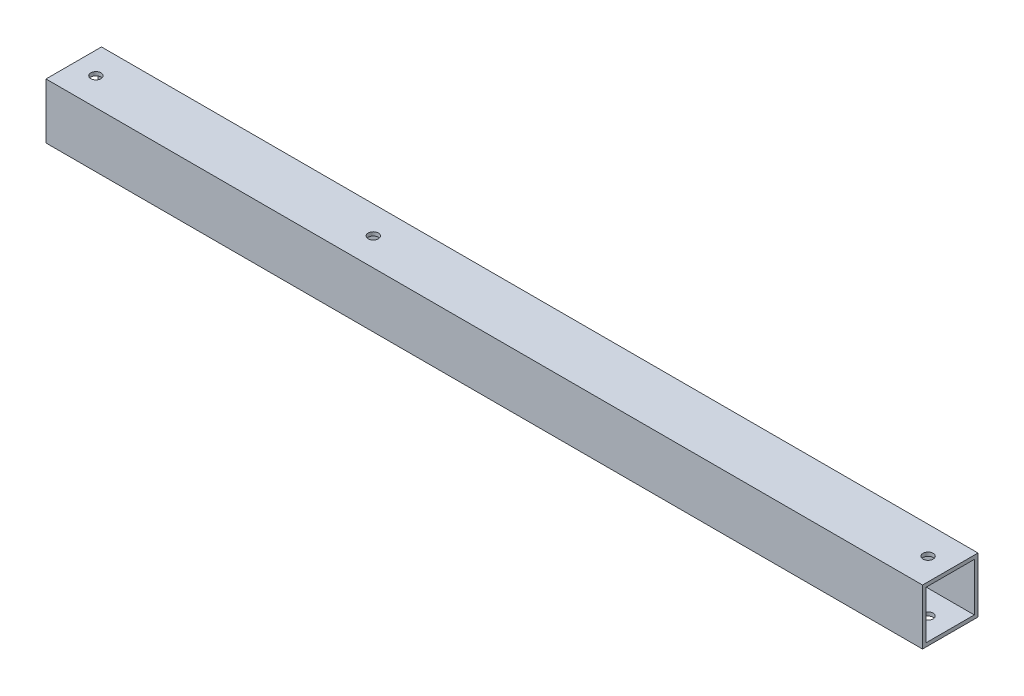
ISO-10303-21;
HEADER;
FILE_DESCRIPTION(('STEP AP214'),'2;1');
FILE_NAME('part.step','',(''),(''),'','','');
FILE_SCHEMA(('AUTOMOTIVE_DESIGN { 1 0 10303 214 1 1 1 1 }'));
ENDSEC;
DATA;
#1=APPLICATION_CONTEXT('core data for automotive mechanical design processes');
#2=APPLICATION_PROTOCOL_DEFINITION('international standard','automotive_design',2000,#1);
#3=PRODUCT_CONTEXT('',#1,'mechanical');
#4=PRODUCT('Part','Part','',(#3));
#5=PRODUCT_RELATED_PRODUCT_CATEGORY('part','',(#4));
#6=PRODUCT_DEFINITION_FORMATION('','',#4);
#7=PRODUCT_DEFINITION_CONTEXT('part definition',#1,'design');
#8=PRODUCT_DEFINITION('design','',#6,#7);
#9=PRODUCT_DEFINITION_SHAPE('','',#8);
#10=(LENGTH_UNIT() NAMED_UNIT(*) SI_UNIT(.MILLI.,.METRE.));
#11=(NAMED_UNIT(*) PLANE_ANGLE_UNIT() SI_UNIT($,.RADIAN.));
#12=(NAMED_UNIT(*) SI_UNIT($,.STERADIAN.) SOLID_ANGLE_UNIT());
#13=UNCERTAINTY_MEASURE_WITH_UNIT(LENGTH_MEASURE(1.E-05),#10,'distance_accuracy_value','');
#14=(GEOMETRIC_REPRESENTATION_CONTEXT(3) GLOBAL_UNCERTAINTY_ASSIGNED_CONTEXT((#13)) GLOBAL_UNIT_ASSIGNED_CONTEXT((#10,
#11,#12)) REPRESENTATION_CONTEXT('',''));
#15=CARTESIAN_POINT('',(0.,0.,0.));
#16=DIRECTION('',(0.,0.,1.));
#17=DIRECTION('',(1.,0.,0.));
#18=AXIS2_PLACEMENT_3D('',#15,#16,#17);
#19=CARTESIAN_POINT('',(237.,0.,0.));
#20=DIRECTION('',(-1.,0.,0.));
#21=DIRECTION('',(0.,0.,1.));
#22=AXIS2_PLACEMENT_3D('',#19,#20,#21);
#23=PLANE('',#22);
#24=DIRECTION('',(0.,-1.,0.));
#25=VECTOR('',#24,1.);
#26=CARTESIAN_POINT('',(237.,15.,15.));
#27=LINE('',#26,#25);
#28=CARTESIAN_POINT('',(237.,15.,15.));
#29=VERTEX_POINT('',#28);
#30=CARTESIAN_POINT('',(237.,-15.,15.));
#31=VERTEX_POINT('',#30);
#32=EDGE_CURVE('E157',#29,#31,#27,.T.);
#33=ORIENTED_EDGE('',*,*,#32,.T.);
#34=DIRECTION('',(0.,0.,-1.));
#35=VECTOR('',#34,1.);
#36=CARTESIAN_POINT('',(237.,-15.,-15.));
#37=LINE('',#36,#35);
#38=CARTESIAN_POINT('',(237.,-15.,-15.));
#39=VERTEX_POINT('',#38);
#40=EDGE_CURVE('E161',#31,#39,#37,.T.);
#41=ORIENTED_EDGE('',*,*,#40,.T.);
#42=DIRECTION('',(0.,1.,0.));
#43=VECTOR('',#42,1.);
#44=CARTESIAN_POINT('',(237.,15.,-15.));
#45=LINE('',#44,#43);
#46=CARTESIAN_POINT('',(237.,15.,-15.));
#47=VERTEX_POINT('',#46);
#48=EDGE_CURVE('E165',#39,#47,#45,.T.);
#49=ORIENTED_EDGE('',*,*,#48,.T.);
#50=DIRECTION('',(0.,0.,1.));
#51=VECTOR('',#50,1.);
#52=CARTESIAN_POINT('',(237.,15.,-15.));
#53=LINE('',#52,#51);
#54=EDGE_CURVE('E168',#47,#29,#53,.T.);
#55=ORIENTED_EDGE('',*,*,#54,.T.);
#56=EDGE_LOOP('',(#33,#41,#49,#55));
#57=FACE_BOUND('',#56,.T.);
#58=DIRECTION('',(0.,1.,0.));
#59=VECTOR('',#58,1.);
#60=CARTESIAN_POINT('',(237.,13.,-13.));
#61=LINE('',#60,#59);
#62=CARTESIAN_POINT('',(237.,-13.,-13.));
#63=VERTEX_POINT('',#62);
#64=CARTESIAN_POINT('',(237.,13.,-13.));
#65=VERTEX_POINT('',#64);
#66=EDGE_CURVE('E107',#63,#65,#61,.T.);
#67=ORIENTED_EDGE('',*,*,#66,.F.);
#68=DIRECTION('',(0.,0.,-1.));
#69=VECTOR('',#68,1.);
#70=CARTESIAN_POINT('',(237.,-13.,13.));
#71=LINE('',#70,#69);
#72=CARTESIAN_POINT('',(237.,-13.,13.));
#73=VERTEX_POINT('',#72);
#74=EDGE_CURVE('E133',#73,#63,#71,.T.);
#75=ORIENTED_EDGE('',*,*,#74,.F.);
#76=DIRECTION('',(0.,-1.,0.));
#77=VECTOR('',#76,1.);
#78=CARTESIAN_POINT('',(237.,13.,13.));
#79=LINE('',#78,#77);
#80=CARTESIAN_POINT('',(237.,13.,13.));
#81=VERTEX_POINT('',#80);
#82=EDGE_CURVE('E129',#81,#73,#79,.T.);
#83=ORIENTED_EDGE('',*,*,#82,.F.);
#84=DIRECTION('',(0.,0.,1.));
#85=VECTOR('',#84,1.);
#86=CARTESIAN_POINT('',(237.,13.,13.));
#87=LINE('',#86,#85);
#88=EDGE_CURVE('E116',#65,#81,#87,.T.);
#89=ORIENTED_EDGE('',*,*,#88,.F.);
#90=EDGE_LOOP('',(#67,#75,#83,#89));
#91=FACE_BOUND('',#90,.T.);
#92=ADVANCED_FACE('F39',(#57,#91),#23,.F.);
#93=CARTESIAN_POINT('',(-237.,0.,0.));
#94=DIRECTION('',(-1.,0.,0.));
#95=DIRECTION('',(0.,0.,1.));
#96=AXIS2_PLACEMENT_3D('',#93,#94,#95);
#97=PLANE('',#96);
#98=DIRECTION('',(0.,-1.,0.));
#99=VECTOR('',#98,1.);
#100=CARTESIAN_POINT('',(-237.,15.,15.));
#101=LINE('',#100,#99);
#102=CARTESIAN_POINT('',(-237.,15.,15.));
#103=VERTEX_POINT('',#102);
#104=CARTESIAN_POINT('',(-237.,-15.,15.));
#105=VERTEX_POINT('',#104);
#106=EDGE_CURVE('E125',#103,#105,#101,.T.);
#107=ORIENTED_EDGE('',*,*,#106,.F.);
#108=DIRECTION('',(0.,0.,1.));
#109=VECTOR('',#108,1.);
#110=CARTESIAN_POINT('',(-237.,15.,-15.));
#111=LINE('',#110,#109);
#112=CARTESIAN_POINT('',(-237.,15.,-15.));
#113=VERTEX_POINT('',#112);
#114=EDGE_CURVE('E162',#113,#103,#111,.T.);
#115=ORIENTED_EDGE('',*,*,#114,.F.);
#116=DIRECTION('',(0.,1.,0.));
#117=VECTOR('',#116,1.);
#118=CARTESIAN_POINT('',(-237.,15.,-15.));
#119=LINE('',#118,#117);
#120=CARTESIAN_POINT('',(-237.,-15.,-15.));
#121=VERTEX_POINT('',#120);
#122=EDGE_CURVE('E178',#121,#113,#119,.T.);
#123=ORIENTED_EDGE('',*,*,#122,.F.);
#124=DIRECTION('',(0.,0.,-1.));
#125=VECTOR('',#124,1.);
#126=CARTESIAN_POINT('',(-237.,-15.,-15.));
#127=LINE('',#126,#125);
#128=EDGE_CURVE('E175',#105,#121,#127,.T.);
#129=ORIENTED_EDGE('',*,*,#128,.F.);
#130=EDGE_LOOP('',(#107,#115,#123,#129));
#131=FACE_BOUND('',#130,.T.);
#132=DIRECTION('',(0.,0.,-1.));
#133=VECTOR('',#132,1.);
#134=CARTESIAN_POINT('',(-237.,-13.,13.));
#135=LINE('',#134,#133);
#136=CARTESIAN_POINT('',(-237.,-13.,13.));
#137=VERTEX_POINT('',#136);
#138=CARTESIAN_POINT('',(-237.,-13.,-13.));
#139=VERTEX_POINT('',#138);
#140=EDGE_CURVE('E117',#137,#139,#135,.T.);
#141=ORIENTED_EDGE('',*,*,#140,.T.);
#142=DIRECTION('',(0.,1.,0.));
#143=VECTOR('',#142,1.);
#144=CARTESIAN_POINT('',(-237.,13.,-13.));
#145=LINE('',#144,#143);
#146=CARTESIAN_POINT('',(-237.,13.,-13.));
#147=VERTEX_POINT('',#146);
#148=EDGE_CURVE('E65',#139,#147,#145,.T.);
#149=ORIENTED_EDGE('',*,*,#148,.T.);
#150=DIRECTION('',(0.,0.,1.));
#151=VECTOR('',#150,1.);
#152=CARTESIAN_POINT('',(-237.,13.,13.));
#153=LINE('',#152,#151);
#154=CARTESIAN_POINT('',(-237.,13.,13.));
#155=VERTEX_POINT('',#154);
#156=EDGE_CURVE('E123',#147,#155,#153,.T.);
#157=ORIENTED_EDGE('',*,*,#156,.T.);
#158=DIRECTION('',(0.,-1.,0.));
#159=VECTOR('',#158,1.);
#160=CARTESIAN_POINT('',(-237.,13.,13.));
#161=LINE('',#160,#159);
#162=EDGE_CURVE('E144',#155,#137,#161,.T.);
#163=ORIENTED_EDGE('',*,*,#162,.T.);
#164=EDGE_LOOP('',(#141,#149,#157,#163));
#165=FACE_BOUND('',#164,.T.);
#166=ADVANCED_FACE('F248',(#131,#165),#97,.T.);
#167=CARTESIAN_POINT('',(237.,15.,15.));
#168=DIRECTION('',(0.,0.,-1.));
#169=DIRECTION('',(0.,1.,0.));
#170=AXIS2_PLACEMENT_3D('',#167,#168,#169);
#171=PLANE('',#170);
#172=ORIENTED_EDGE('',*,*,#106,.T.);
#173=DIRECTION('',(-1.,0.,0.));
#174=VECTOR('',#173,1.);
#175=CARTESIAN_POINT('',(237.,-15.,15.));
#176=LINE('',#175,#174);
#177=EDGE_CURVE('E11',#31,#105,#176,.T.);
#178=ORIENTED_EDGE('',*,*,#177,.F.);
#179=ORIENTED_EDGE('',*,*,#32,.F.);
#180=DIRECTION('',(-1.,0.,0.));
#181=VECTOR('',#180,1.);
#182=CARTESIAN_POINT('',(237.,15.,15.));
#183=LINE('',#182,#181);
#184=EDGE_CURVE('E171',#29,#103,#183,.T.);
#185=ORIENTED_EDGE('',*,*,#184,.T.);
#186=EDGE_LOOP('',(#172,#178,#179,#185));
#187=FACE_BOUND('',#186,.T.);
#188=ADVANCED_FACE('F41',(#187),#171,.F.);
#189=CARTESIAN_POINT('',(237.,-15.,-15.));
#190=DIRECTION('',(0.,1.,0.));
#191=DIRECTION('',(0.,0.,1.));
#192=AXIS2_PLACEMENT_3D('',#189,#190,#191);
#193=PLANE('',#192);
#194=CARTESIAN_POINT('',(-75.,-15.,0.));
#195=DIRECTION('',(0.,1.,0.));
#196=DIRECTION('',(0.,0.,1.));
#197=AXIS2_PLACEMENT_3D('',#194,#195,#196);
#198=CIRCLE('',#197,2.74999999999999);
#199=CARTESIAN_POINT('',(-75.,-15.,2.74999999999999));
#200=VERTEX_POINT('',#199);
#201=EDGE_CURVE('E273',#200,#200,#198,.T.);
#202=ORIENTED_EDGE('',*,*,#201,.T.);
#203=EDGE_LOOP('',(#202));
#204=FACE_BOUND('',#203,.T.);
#205=CARTESIAN_POINT('',(-225.,-15.,0.));
#206=DIRECTION('',(0.,-1.,0.));
#207=DIRECTION('',(0.,0.,1.));
#208=AXIS2_PLACEMENT_3D('',#205,#206,#207);
#209=CIRCLE('',#208,2.75000000000001);
#210=CARTESIAN_POINT('',(-225.,-15.,2.75000000000001));
#211=VERTEX_POINT('',#210);
#212=EDGE_CURVE('E201',#211,#211,#209,.T.);
#213=ORIENTED_EDGE('',*,*,#212,.F.);
#214=EDGE_LOOP('',(#213));
#215=FACE_BOUND('',#214,.T.);
#216=CARTESIAN_POINT('',(225.,-15.,0.));
#217=DIRECTION('',(0.,1.,0.));
#218=DIRECTION('',(0.,0.,1.));
#219=AXIS2_PLACEMENT_3D('',#216,#217,#218);
#220=CIRCLE('',#219,2.75000000000001);
#221=CARTESIAN_POINT('',(225.,-15.,2.75000000000001));
#222=VERTEX_POINT('',#221);
#223=EDGE_CURVE('E196',#222,#222,#220,.T.);
#224=ORIENTED_EDGE('',*,*,#223,.T.);
#225=EDGE_LOOP('',(#224));
#226=FACE_BOUND('',#225,.T.);
#227=ORIENTED_EDGE('',*,*,#128,.T.);
#228=DIRECTION('',(-1.,0.,0.));
#229=VECTOR('',#228,1.);
#230=CARTESIAN_POINT('',(237.,-15.,-15.));
#231=LINE('',#230,#229);
#232=EDGE_CURVE('E49',#39,#121,#231,.T.);
#233=ORIENTED_EDGE('',*,*,#232,.F.);
#234=ORIENTED_EDGE('',*,*,#40,.F.);
#235=ORIENTED_EDGE('',*,*,#177,.T.);
#236=EDGE_LOOP('',(#227,#233,#234,#235));
#237=FACE_BOUND('',#236,.T.);
#238=ADVANCED_FACE('F262',(#204,#215,#226,#237),#193,.F.);
#239=CARTESIAN_POINT('',(237.,15.,-15.));
#240=DIRECTION('',(0.,0.,1.));
#241=DIRECTION('',(0.,-1.,0.));
#242=AXIS2_PLACEMENT_3D('',#239,#240,#241);
#243=PLANE('',#242);
#244=ORIENTED_EDGE('',*,*,#122,.T.);
#245=DIRECTION('',(-1.,0.,0.));
#246=VECTOR('',#245,1.);
#247=CARTESIAN_POINT('',(237.,15.,-15.));
#248=LINE('',#247,#246);
#249=EDGE_CURVE('E186',#47,#113,#248,.T.);
#250=ORIENTED_EDGE('',*,*,#249,.F.);
#251=ORIENTED_EDGE('',*,*,#48,.F.);
#252=ORIENTED_EDGE('',*,*,#232,.T.);
#253=EDGE_LOOP('',(#244,#250,#251,#252));
#254=FACE_BOUND('',#253,.T.);
#255=ADVANCED_FACE('F259',(#254),#243,.F.);
#256=CARTESIAN_POINT('',(237.,15.,-15.));
#257=DIRECTION('',(0.,-1.,0.));
#258=DIRECTION('',(0.,0.,-1.));
#259=AXIS2_PLACEMENT_3D('',#256,#257,#258);
#260=PLANE('',#259);
#261=CARTESIAN_POINT('',(-75.,15.,0.));
#262=DIRECTION('',(0.,1.,0.));
#263=DIRECTION('',(0.,0.,1.));
#264=AXIS2_PLACEMENT_3D('',#261,#262,#263);
#265=CIRCLE('',#264,2.74999999999999);
#266=CARTESIAN_POINT('',(-75.,15.,2.74999999999999));
#267=VERTEX_POINT('',#266);
#268=EDGE_CURVE('E319',#267,#267,#265,.T.);
#269=ORIENTED_EDGE('',*,*,#268,.F.);
#270=EDGE_LOOP('',(#269));
#271=FACE_BOUND('',#270,.T.);
#272=CARTESIAN_POINT('',(-225.,15.,0.));
#273=DIRECTION('',(0.,-1.,0.));
#274=DIRECTION('',(0.,0.,1.));
#275=AXIS2_PLACEMENT_3D('',#272,#273,#274);
#276=CIRCLE('',#275,2.75000000000001);
#277=CARTESIAN_POINT('',(-225.,15.,2.75000000000001));
#278=VERTEX_POINT('',#277);
#279=EDGE_CURVE('E210',#278,#278,#276,.T.);
#280=ORIENTED_EDGE('',*,*,#279,.T.);
#281=EDGE_LOOP('',(#280));
#282=FACE_BOUND('',#281,.T.);
#283=CARTESIAN_POINT('',(225.,15.,0.));
#284=DIRECTION('',(0.,1.,0.));
#285=DIRECTION('',(0.,0.,1.));
#286=AXIS2_PLACEMENT_3D('',#283,#284,#285);
#287=CIRCLE('',#286,2.75000000000001);
#288=CARTESIAN_POINT('',(225.,15.,2.75000000000001));
#289=VERTEX_POINT('',#288);
#290=EDGE_CURVE('E207',#289,#289,#287,.T.);
#291=ORIENTED_EDGE('',*,*,#290,.F.);
#292=EDGE_LOOP('',(#291));
#293=FACE_BOUND('',#292,.T.);
#294=ORIENTED_EDGE('',*,*,#114,.T.);
#295=ORIENTED_EDGE('',*,*,#184,.F.);
#296=ORIENTED_EDGE('',*,*,#54,.F.);
#297=ORIENTED_EDGE('',*,*,#249,.T.);
#298=EDGE_LOOP('',(#294,#295,#296,#297));
#299=FACE_BOUND('',#298,.T.);
#300=ADVANCED_FACE('F243',(#271,#282,#293,#299),#260,.F.);
#301=CARTESIAN_POINT('',(237.,13.,-13.));
#302=DIRECTION('',(0.,0.,1.));
#303=DIRECTION('',(1.,0.,0.));
#304=AXIS2_PLACEMENT_3D('',#301,#302,#303);
#305=PLANE('',#304);
#306=ORIENTED_EDGE('',*,*,#148,.F.);
#307=DIRECTION('',(-1.,0.,0.));
#308=VECTOR('',#307,1.);
#309=CARTESIAN_POINT('',(237.,-13.,-13.));
#310=LINE('',#309,#308);
#311=EDGE_CURVE('E111',#63,#139,#310,.T.);
#312=ORIENTED_EDGE('',*,*,#311,.F.);
#313=ORIENTED_EDGE('',*,*,#66,.T.);
#314=DIRECTION('',(-1.,0.,0.));
#315=VECTOR('',#314,1.);
#316=CARTESIAN_POINT('',(237.,13.,-13.));
#317=LINE('',#316,#315);
#318=EDGE_CURVE('E110',#65,#147,#317,.T.);
#319=ORIENTED_EDGE('',*,*,#318,.T.);
#320=EDGE_LOOP('',(#306,#312,#313,#319));
#321=FACE_BOUND('',#320,.T.);
#322=ADVANCED_FACE('F109',(#321),#305,.T.);
#323=CARTESIAN_POINT('',(237.,13.,13.));
#324=DIRECTION('',(0.,-1.,0.));
#325=DIRECTION('',(0.,0.,-1.));
#326=AXIS2_PLACEMENT_3D('',#323,#324,#325);
#327=PLANE('',#326);
#328=CARTESIAN_POINT('',(-75.,13.,0.));
#329=DIRECTION('',(0.,-1.,0.));
#330=DIRECTION('',(0.,0.,-1.));
#331=AXIS2_PLACEMENT_3D('',#328,#329,#330);
#332=CIRCLE('',#331,2.74999999999999);
#333=CARTESIAN_POINT('',(-75.,13.,-2.74999999999999));
#334=VERTEX_POINT('',#333);
#335=EDGE_CURVE('E216',#334,#334,#332,.T.);
#336=ORIENTED_EDGE('',*,*,#335,.F.);
#337=EDGE_LOOP('',(#336));
#338=FACE_BOUND('',#337,.T.);
#339=CARTESIAN_POINT('',(-225.,13.,0.));
#340=DIRECTION('',(0.,-1.,0.));
#341=DIRECTION('',(0.,0.,-1.));
#342=AXIS2_PLACEMENT_3D('',#339,#340,#341);
#343=CIRCLE('',#342,2.75000000000001);
#344=CARTESIAN_POINT('',(-225.,13.,-2.75000000000001));
#345=VERTEX_POINT('',#344);
#346=EDGE_CURVE('E200',#345,#345,#343,.F.);
#347=ORIENTED_EDGE('',*,*,#346,.T.);
#348=EDGE_LOOP('',(#347));
#349=FACE_BOUND('',#348,.T.);
#350=CARTESIAN_POINT('',(225.,13.,0.));
#351=DIRECTION('',(0.,-1.,0.));
#352=DIRECTION('',(0.,0.,-1.));
#353=AXIS2_PLACEMENT_3D('',#350,#351,#352);
#354=CIRCLE('',#353,2.75000000000001);
#355=CARTESIAN_POINT('',(225.,13.,-2.75000000000001));
#356=VERTEX_POINT('',#355);
#357=EDGE_CURVE('E141',#356,#356,#354,.T.);
#358=ORIENTED_EDGE('',*,*,#357,.F.);
#359=EDGE_LOOP('',(#358));
#360=FACE_BOUND('',#359,.T.);
#361=ORIENTED_EDGE('',*,*,#156,.F.);
#362=ORIENTED_EDGE('',*,*,#318,.F.);
#363=ORIENTED_EDGE('',*,*,#88,.T.);
#364=DIRECTION('',(-1.,0.,0.));
#365=VECTOR('',#364,1.);
#366=CARTESIAN_POINT('',(237.,13.,13.));
#367=LINE('',#366,#365);
#368=EDGE_CURVE('E126',#81,#155,#367,.T.);
#369=ORIENTED_EDGE('',*,*,#368,.T.);
#370=EDGE_LOOP('',(#361,#362,#363,#369));
#371=FACE_BOUND('',#370,.T.);
#372=ADVANCED_FACE('F120',(#338,#349,#360,#371),#327,.T.);
#373=CARTESIAN_POINT('',(237.,13.,13.));
#374=DIRECTION('',(0.,0.,-1.));
#375=DIRECTION('',(-1.,0.,0.));
#376=AXIS2_PLACEMENT_3D('',#373,#374,#375);
#377=PLANE('',#376);
#378=ORIENTED_EDGE('',*,*,#162,.F.);
#379=ORIENTED_EDGE('',*,*,#368,.F.);
#380=ORIENTED_EDGE('',*,*,#82,.T.);
#381=DIRECTION('',(-1.,0.,0.));
#382=VECTOR('',#381,1.);
#383=CARTESIAN_POINT('',(237.,-13.,13.));
#384=LINE('',#383,#382);
#385=EDGE_CURVE('E57',#73,#137,#384,.T.);
#386=ORIENTED_EDGE('',*,*,#385,.T.);
#387=EDGE_LOOP('',(#378,#379,#380,#386));
#388=FACE_BOUND('',#387,.T.);
#389=ADVANCED_FACE('F233',(#388),#377,.T.);
#390=CARTESIAN_POINT('',(237.,-13.,13.));
#391=DIRECTION('',(0.,1.,0.));
#392=DIRECTION('',(0.,0.,1.));
#393=AXIS2_PLACEMENT_3D('',#390,#391,#392);
#394=PLANE('',#393);
#395=CARTESIAN_POINT('',(-75.,-13.,0.));
#396=DIRECTION('',(0.,1.,0.));
#397=DIRECTION('',(0.,0.,1.));
#398=AXIS2_PLACEMENT_3D('',#395,#396,#397);
#399=CIRCLE('',#398,2.74999999999999);
#400=CARTESIAN_POINT('',(-75.,-13.,2.74999999999999));
#401=VERTEX_POINT('',#400);
#402=EDGE_CURVE('E43',#401,#401,#399,.T.);
#403=ORIENTED_EDGE('',*,*,#402,.F.);
#404=EDGE_LOOP('',(#403));
#405=FACE_BOUND('',#404,.T.);
#406=CARTESIAN_POINT('',(-225.,-13.,0.));
#407=DIRECTION('',(0.,1.,0.));
#408=DIRECTION('',(0.,0.,1.));
#409=AXIS2_PLACEMENT_3D('',#406,#407,#408);
#410=CIRCLE('',#409,2.75000000000001);
#411=CARTESIAN_POINT('',(-225.,-13.,2.75000000000001));
#412=VERTEX_POINT('',#411);
#413=EDGE_CURVE('E197',#412,#412,#410,.F.);
#414=ORIENTED_EDGE('',*,*,#413,.T.);
#415=EDGE_LOOP('',(#414));
#416=FACE_BOUND('',#415,.T.);
#417=CARTESIAN_POINT('',(225.,-13.,0.));
#418=DIRECTION('',(0.,1.,0.));
#419=DIRECTION('',(0.,0.,1.));
#420=AXIS2_PLACEMENT_3D('',#417,#418,#419);
#421=CIRCLE('',#420,2.75000000000001);
#422=CARTESIAN_POINT('',(225.,-13.,2.75000000000001));
#423=VERTEX_POINT('',#422);
#424=EDGE_CURVE('E193',#423,#423,#421,.T.);
#425=ORIENTED_EDGE('',*,*,#424,.F.);
#426=EDGE_LOOP('',(#425));
#427=FACE_BOUND('',#426,.T.);
#428=ORIENTED_EDGE('',*,*,#140,.F.);
#429=ORIENTED_EDGE('',*,*,#385,.F.);
#430=ORIENTED_EDGE('',*,*,#74,.T.);
#431=ORIENTED_EDGE('',*,*,#311,.T.);
#432=EDGE_LOOP('',(#428,#429,#430,#431));
#433=FACE_BOUND('',#432,.T.);
#434=ADVANCED_FACE('F240',(#405,#416,#427,#433),#394,.T.);
#435=CARTESIAN_POINT('',(225.,-15.,0.));
#436=DIRECTION('',(0.,1.,0.));
#437=DIRECTION('',(0.,0.,1.));
#438=AXIS2_PLACEMENT_3D('',#435,#436,#437);
#439=CYLINDRICAL_SURFACE('',#438,2.75000000000001);
#440=ORIENTED_EDGE('',*,*,#424,.T.);
#441=EDGE_LOOP('',(#440));
#442=FACE_BOUND('',#441,.T.);
#443=ORIENTED_EDGE('',*,*,#223,.F.);
#444=EDGE_LOOP('',(#443));
#445=FACE_BOUND('',#444,.T.);
#446=ADVANCED_FACE('F291',(#442,#445),#439,.F.);
#447=ORIENTED_EDGE('',*,*,#357,.T.);
#448=EDGE_LOOP('',(#447));
#449=FACE_BOUND('',#448,.T.);
#450=ORIENTED_EDGE('',*,*,#290,.T.);
#451=EDGE_LOOP('',(#450));
#452=FACE_BOUND('',#451,.T.);
#453=ADVANCED_FACE('F229',(#449,#452),#439,.F.);
#454=CARTESIAN_POINT('',(-225.,-15.,0.));
#455=DIRECTION('',(0.,1.,0.));
#456=DIRECTION('',(0.,0.,1.));
#457=AXIS2_PLACEMENT_3D('',#454,#455,#456);
#458=CYLINDRICAL_SURFACE('',#457,2.75000000000001);
#459=ORIENTED_EDGE('',*,*,#413,.F.);
#460=EDGE_LOOP('',(#459));
#461=FACE_BOUND('',#460,.T.);
#462=ORIENTED_EDGE('',*,*,#212,.T.);
#463=EDGE_LOOP('',(#462));
#464=FACE_BOUND('',#463,.T.);
#465=ADVANCED_FACE('F301',(#461,#464),#458,.F.);
#466=ORIENTED_EDGE('',*,*,#346,.F.);
#467=EDGE_LOOP('',(#466));
#468=FACE_BOUND('',#467,.T.);
#469=ORIENTED_EDGE('',*,*,#279,.F.);
#470=EDGE_LOOP('',(#469));
#471=FACE_BOUND('',#470,.T.);
#472=ADVANCED_FACE('F304',(#468,#471),#458,.F.);
#473=CARTESIAN_POINT('',(-75.,-15.,0.));
#474=DIRECTION('',(0.,1.,0.));
#475=DIRECTION('',(0.,0.,1.));
#476=AXIS2_PLACEMENT_3D('',#473,#474,#475);
#477=CYLINDRICAL_SURFACE('',#476,2.74999999999999);
#478=ORIENTED_EDGE('',*,*,#402,.T.);
#479=EDGE_LOOP('',(#478));
#480=FACE_BOUND('',#479,.T.);
#481=ORIENTED_EDGE('',*,*,#201,.F.);
#482=EDGE_LOOP('',(#481));
#483=FACE_BOUND('',#482,.T.);
#484=ADVANCED_FACE('F306',(#480,#483),#477,.F.);
#485=ORIENTED_EDGE('',*,*,#335,.T.);
#486=EDGE_LOOP('',(#485));
#487=FACE_BOUND('',#486,.T.);
#488=ORIENTED_EDGE('',*,*,#268,.T.);
#489=EDGE_LOOP('',(#488));
#490=FACE_BOUND('',#489,.T.);
#491=ADVANCED_FACE('F308',(#487,#490),#477,.F.);
#492=CLOSED_SHELL('',(#92,#166,#188,#238,#255,#300,#322,#372,#389,#434,#446,#453,#465,#472,#484,#491));
#493=MANIFOLD_SOLID_BREP('B2',#492);
#494=ADVANCED_BREP_SHAPE_REPRESENTATION('',(#18,#493),#14);
#495=SHAPE_DEFINITION_REPRESENTATION(#9,#494);
ENDSEC;
END-ISO-10303-21;
